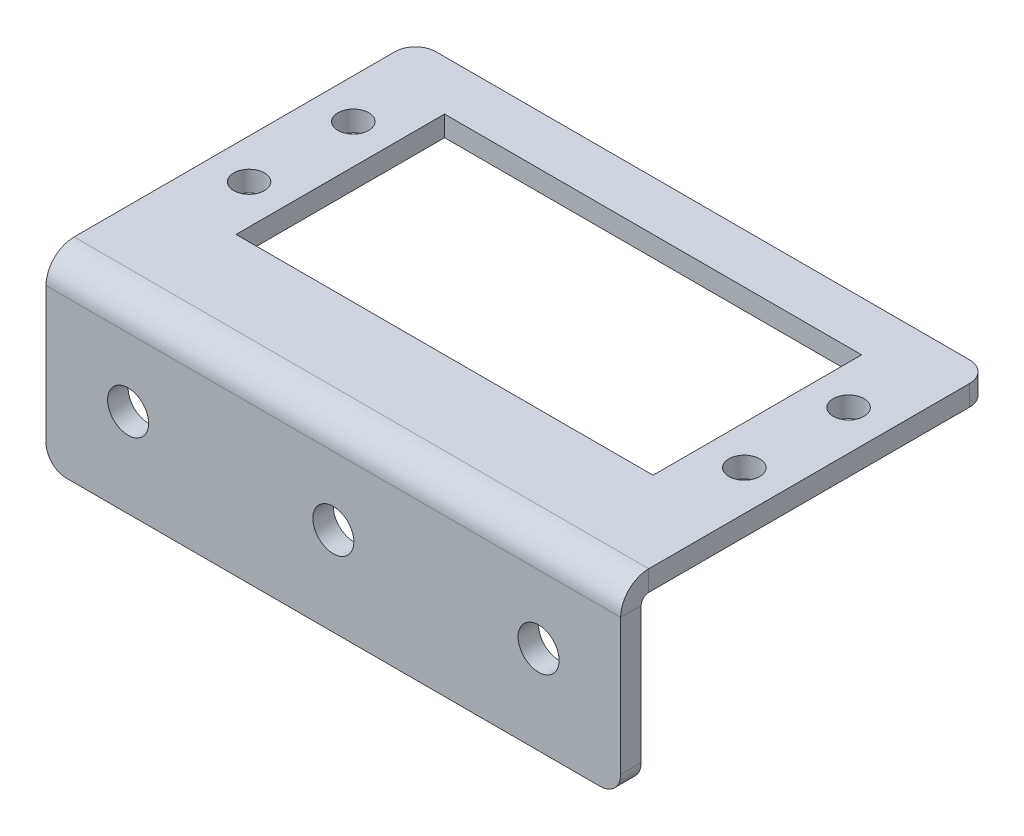
ISO-10303-21;
HEADER;
FILE_DESCRIPTION(('STEP AP214'),'2;1');
FILE_NAME('part.step','',(''),(''),'','','');
FILE_SCHEMA(('AUTOMOTIVE_DESIGN { 1 0 10303 214 1 1 1 1 }'));
ENDSEC;
DATA;
#1=APPLICATION_CONTEXT('core data for automotive mechanical design processes');
#2=APPLICATION_PROTOCOL_DEFINITION('international standard','automotive_design',2000,#1);
#3=PRODUCT_CONTEXT('',#1,'mechanical');
#4=PRODUCT('Part','Part','',(#3));
#5=PRODUCT_RELATED_PRODUCT_CATEGORY('part','',(#4));
#6=PRODUCT_DEFINITION_FORMATION('','',#4);
#7=PRODUCT_DEFINITION_CONTEXT('part definition',#1,'design');
#8=PRODUCT_DEFINITION('design','',#6,#7);
#9=PRODUCT_DEFINITION_SHAPE('','',#8);
#10=(LENGTH_UNIT() NAMED_UNIT(*) SI_UNIT(.MILLI.,.METRE.));
#11=(NAMED_UNIT(*) PLANE_ANGLE_UNIT() SI_UNIT($,.RADIAN.));
#12=(NAMED_UNIT(*) SI_UNIT($,.STERADIAN.) SOLID_ANGLE_UNIT());
#13=UNCERTAINTY_MEASURE_WITH_UNIT(LENGTH_MEASURE(1.E-05),#10,'distance_accuracy_value','');
#14=(GEOMETRIC_REPRESENTATION_CONTEXT(3) GLOBAL_UNCERTAINTY_ASSIGNED_CONTEXT((#13)) GLOBAL_UNIT_ASSIGNED_CONTEXT((#10,
#11,#12)) REPRESENTATION_CONTEXT('',''));
#15=CARTESIAN_POINT('',(0.,0.,0.));
#16=DIRECTION('',(0.,0.,1.));
#17=DIRECTION('',(1.,0.,0.));
#18=AXIS2_PLACEMENT_3D('',#15,#16,#17);
#19=CARTESIAN_POINT('',(-28.,-2.,-17.));
#20=DIRECTION('',(-1.,0.,0.));
#21=DIRECTION('',(0.,0.,1.));
#22=AXIS2_PLACEMENT_3D('',#19,#20,#21);
#23=PLANE('',#22);
#24=DIRECTION('',(0.,0.,1.));
#25=VECTOR('',#24,1.);
#26=CARTESIAN_POINT('',(-28.,0.,-17.));
#27=LINE('',#26,#25);
#28=CARTESIAN_POINT('',(-28.,0.,-15.));
#29=VERTEX_POINT('',#28);
#30=CARTESIAN_POINT('',(-28.,0.,16.2634));
#31=VERTEX_POINT('',#30);
#32=EDGE_CURVE('E249',#29,#31,#27,.T.);
#33=ORIENTED_EDGE('',*,*,#32,.F.);
#34=DIRECTION('',(0.,1.,0.));
#35=VECTOR('',#34,1.);
#36=CARTESIAN_POINT('',(-28.,-2.,-15.));
#37=LINE('',#36,#35);
#38=CARTESIAN_POINT('',(-28.,-2.,-15.));
#39=VERTEX_POINT('',#38);
#40=EDGE_CURVE('E11',#29,#39,#37,.F.);
#41=ORIENTED_EDGE('',*,*,#40,.T.);
#42=DIRECTION('',(0.,0.,1.));
#43=VECTOR('',#42,1.);
#44=CARTESIAN_POINT('',(-28.,-2.,-17.));
#45=LINE('',#44,#43);
#46=CARTESIAN_POINT('',(-28.,-1.99999999999999,16.2634));
#47=VERTEX_POINT('',#46);
#48=EDGE_CURVE('E251',#39,#47,#45,.T.);
#49=ORIENTED_EDGE('',*,*,#48,.T.);
#50=DIRECTION('',(0.,1.,0.));
#51=VECTOR('',#50,1.);
#52=CARTESIAN_POINT('',(-28.,-1.99999999999999,16.2634));
#53=LINE('',#52,#51);
#54=EDGE_CURVE('E229',#47,#31,#53,.T.);
#55=ORIENTED_EDGE('',*,*,#54,.T.);
#56=EDGE_LOOP('',(#33,#41,#49,#55));
#57=FACE_BOUND('',#56,.T.);
#58=ADVANCED_FACE('F37',(#57),#23,.T.);
#59=CARTESIAN_POINT('',(0.,-2.,0.));
#60=DIRECTION('',(0.,1.,0.));
#61=DIRECTION('',(0.,0.,1.));
#62=AXIS2_PLACEMENT_3D('',#59,#60,#61);
#63=PLANE('',#62);
#64=CARTESIAN_POINT('',(24.13,-2.,3.07999999999134));
#65=DIRECTION('',(0.,1.,0.));
#66=DIRECTION('',(0.,0.,1.));
#67=AXIS2_PLACEMENT_3D('',#64,#65,#66);
#68=CIRCLE('',#67,1.5);
#69=CARTESIAN_POINT('',(24.13,-2.,4.57999999999135));
#70=VERTEX_POINT('',#69);
#71=EDGE_CURVE('E555',#70,#70,#68,.T.);
#72=ORIENTED_EDGE('',*,*,#71,.T.);
#73=EDGE_LOOP('',(#72));
#74=FACE_BOUND('',#73,.T.);
#75=CARTESIAN_POINT('',(24.13,-2.,-7.08000000000865));
#76=DIRECTION('',(0.,1.,0.));
#77=DIRECTION('',(0.,0.,1.));
#78=AXIS2_PLACEMENT_3D('',#75,#76,#77);
#79=CIRCLE('',#78,1.5);
#80=CARTESIAN_POINT('',(24.13,-2.,-5.58000000000865));
#81=VERTEX_POINT('',#80);
#82=EDGE_CURVE('E561',#81,#81,#79,.T.);
#83=ORIENTED_EDGE('',*,*,#82,.T.);
#84=EDGE_LOOP('',(#83));
#85=FACE_BOUND('',#84,.T.);
#86=CARTESIAN_POINT('',(-24.13,-2.,3.07999999999134));
#87=DIRECTION('',(0.,1.,0.));
#88=DIRECTION('',(0.,0.,1.));
#89=AXIS2_PLACEMENT_3D('',#86,#87,#88);
#90=CIRCLE('',#89,1.5);
#91=CARTESIAN_POINT('',(-24.13,-2.,4.57999999999135));
#92=VERTEX_POINT('',#91);
#93=EDGE_CURVE('E567',#92,#92,#90,.T.);
#94=ORIENTED_EDGE('',*,*,#93,.T.);
#95=EDGE_LOOP('',(#94));
#96=FACE_BOUND('',#95,.T.);
#97=CARTESIAN_POINT('',(-24.13,-2.,-7.08000000000865));
#98=DIRECTION('',(0.,1.,0.));
#99=DIRECTION('',(0.,0.,1.));
#100=AXIS2_PLACEMENT_3D('',#97,#98,#99);
#101=CIRCLE('',#100,1.5);
#102=CARTESIAN_POINT('',(-24.13,-2.,-5.58000000000865));
#103=VERTEX_POINT('',#102);
#104=EDGE_CURVE('E573',#103,#103,#101,.T.);
#105=ORIENTED_EDGE('',*,*,#104,.T.);
#106=EDGE_LOOP('',(#105));
#107=FACE_BOUND('',#106,.T.);
#108=DIRECTION('',(-1.,0.,0.));
#109=VECTOR('',#108,1.);
#110=CARTESIAN_POINT('',(0.,-2.,-12.1600000000087));
#111=LINE('',#110,#109);
#112=CARTESIAN_POINT('',(20.32,-2.,-12.1600000000087));
#113=VERTEX_POINT('',#112);
#114=CARTESIAN_POINT('',(-20.32,-2.,-12.1600000000087));
#115=VERTEX_POINT('',#114);
#116=EDGE_CURVE('E188',#113,#115,#111,.T.);
#117=ORIENTED_EDGE('',*,*,#116,.T.);
#118=DIRECTION('',(0.,0.,1.));
#119=VECTOR('',#118,1.);
#120=CARTESIAN_POINT('',(-20.32,-2.,0.));
#121=LINE('',#120,#119);
#122=CARTESIAN_POINT('',(-20.32,-2.,8.15999999999125));
#123=VERTEX_POINT('',#122);
#124=EDGE_CURVE('E191',#115,#123,#121,.T.);
#125=ORIENTED_EDGE('',*,*,#124,.T.);
#126=DIRECTION('',(1.,0.,0.));
#127=VECTOR('',#126,1.);
#128=CARTESIAN_POINT('',(0.,-2.,8.15999999999125));
#129=LINE('',#128,#127);
#130=CARTESIAN_POINT('',(20.32,-2.,8.15999999999125));
#131=VERTEX_POINT('',#130);
#132=EDGE_CURVE('E183',#123,#131,#129,.T.);
#133=ORIENTED_EDGE('',*,*,#132,.T.);
#134=DIRECTION('',(0.,0.,-1.));
#135=VECTOR('',#134,1.);
#136=CARTESIAN_POINT('',(20.32,-2.,0.));
#137=LINE('',#136,#135);
#138=EDGE_CURVE('E158',#131,#113,#137,.T.);
#139=ORIENTED_EDGE('',*,*,#138,.T.);
#140=EDGE_LOOP('',(#117,#125,#133,#139));
#141=FACE_BOUND('',#140,.T.);
#142=DIRECTION('',(-1.,0.,0.));
#143=VECTOR('',#142,1.);
#144=CARTESIAN_POINT('',(-28.,-2.,-17.));
#145=LINE('',#144,#143);
#146=CARTESIAN_POINT('',(26.,-2.,-17.));
#147=VERTEX_POINT('',#146);
#148=CARTESIAN_POINT('',(-26.,-2.,-17.));
#149=VERTEX_POINT('',#148);
#150=EDGE_CURVE('E248',#147,#149,#145,.T.);
#151=ORIENTED_EDGE('',*,*,#150,.F.);
#152=CARTESIAN_POINT('',(26.,-2.,-15.));
#153=DIRECTION('',(0.,1.,0.));
#154=DIRECTION('',(0.,0.,1.));
#155=AXIS2_PLACEMENT_3D('',#152,#153,#154);
#156=CIRCLE('',#155,2.);
#157=CARTESIAN_POINT('',(28.,-2.,-15.));
#158=VERTEX_POINT('',#157);
#159=EDGE_CURVE('E45',#147,#158,#156,.F.);
#160=ORIENTED_EDGE('',*,*,#159,.T.);
#161=DIRECTION('',(0.,0.,-1.));
#162=VECTOR('',#161,1.);
#163=CARTESIAN_POINT('',(28.,-2.,-17.));
#164=LINE('',#163,#162);
#165=CARTESIAN_POINT('',(28.,-1.99999999999999,16.2634));
#166=VERTEX_POINT('',#165);
#167=EDGE_CURVE('E245',#166,#158,#164,.T.);
#168=ORIENTED_EDGE('',*,*,#167,.F.);
#169=DIRECTION('',(-1.,0.,0.));
#170=VECTOR('',#169,1.);
#171=CARTESIAN_POINT('',(-28.,-1.99999999999999,16.2634));
#172=LINE('',#171,#170);
#173=EDGE_CURVE('E235',#47,#166,#172,.F.);
#174=ORIENTED_EDGE('',*,*,#173,.F.);
#175=ORIENTED_EDGE('',*,*,#48,.F.);
#176=CARTESIAN_POINT('',(-26.,-2.,-15.));
#177=DIRECTION('',(0.,1.,0.));
#178=DIRECTION('',(0.,0.,1.));
#179=AXIS2_PLACEMENT_3D('',#176,#177,#178);
#180=CIRCLE('',#179,2.);
#181=EDGE_CURVE('E57',#39,#149,#180,.F.);
#182=ORIENTED_EDGE('',*,*,#181,.T.);
#183=EDGE_LOOP('',(#151,#160,#168,#174,#175,#182));
#184=FACE_BOUND('',#183,.T.);
#185=ADVANCED_FACE('F291',(#74,#85,#96,#107,#141,#184),#63,.F.);
#186=CARTESIAN_POINT('',(0.,0.,0.));
#187=DIRECTION('',(0.,1.,0.));
#188=DIRECTION('',(0.,0.,1.));
#189=AXIS2_PLACEMENT_3D('',#186,#187,#188);
#190=PLANE('',#189);
#191=CARTESIAN_POINT('',(24.13,0.,3.07999999999134));
#192=DIRECTION('',(0.,1.,0.));
#193=DIRECTION('',(0.,0.,1.));
#194=AXIS2_PLACEMENT_3D('',#191,#192,#193);
#195=CIRCLE('',#194,1.5);
#196=CARTESIAN_POINT('',(24.13,0.,4.57999999999135));
#197=VERTEX_POINT('',#196);
#198=EDGE_CURVE('E550',#197,#197,#195,.T.);
#199=ORIENTED_EDGE('',*,*,#198,.F.);
#200=EDGE_LOOP('',(#199));
#201=FACE_BOUND('',#200,.T.);
#202=CARTESIAN_POINT('',(24.13,0.,-7.08000000000865));
#203=DIRECTION('',(0.,1.,0.));
#204=DIRECTION('',(0.,0.,1.));
#205=AXIS2_PLACEMENT_3D('',#202,#203,#204);
#206=CIRCLE('',#205,1.5);
#207=CARTESIAN_POINT('',(24.13,0.,-5.58000000000865));
#208=VERTEX_POINT('',#207);
#209=EDGE_CURVE('E558',#208,#208,#206,.T.);
#210=ORIENTED_EDGE('',*,*,#209,.F.);
#211=EDGE_LOOP('',(#210));
#212=FACE_BOUND('',#211,.T.);
#213=CARTESIAN_POINT('',(-24.13,0.,3.07999999999134));
#214=DIRECTION('',(0.,1.,0.));
#215=DIRECTION('',(0.,0.,1.));
#216=AXIS2_PLACEMENT_3D('',#213,#214,#215);
#217=CIRCLE('',#216,1.5);
#218=CARTESIAN_POINT('',(-24.13,0.,4.57999999999135));
#219=VERTEX_POINT('',#218);
#220=EDGE_CURVE('E564',#219,#219,#217,.T.);
#221=ORIENTED_EDGE('',*,*,#220,.F.);
#222=EDGE_LOOP('',(#221));
#223=FACE_BOUND('',#222,.T.);
#224=CARTESIAN_POINT('',(-24.13,0.,-7.08000000000865));
#225=DIRECTION('',(0.,1.,0.));
#226=DIRECTION('',(0.,0.,1.));
#227=AXIS2_PLACEMENT_3D('',#224,#225,#226);
#228=CIRCLE('',#227,1.5);
#229=CARTESIAN_POINT('',(-24.13,0.,-5.58000000000865));
#230=VERTEX_POINT('',#229);
#231=EDGE_CURVE('E570',#230,#230,#228,.T.);
#232=ORIENTED_EDGE('',*,*,#231,.F.);
#233=EDGE_LOOP('',(#232));
#234=FACE_BOUND('',#233,.T.);
#235=DIRECTION('',(0.,0.,1.));
#236=VECTOR('',#235,1.);
#237=CARTESIAN_POINT('',(-20.32,0.,-12.1600000000087));
#238=LINE('',#237,#236);
#239=CARTESIAN_POINT('',(-20.32,0.,-12.1600000000087));
#240=VERTEX_POINT('',#239);
#241=CARTESIAN_POINT('',(-20.32,0.,8.15999999999125));
#242=VERTEX_POINT('',#241);
#243=EDGE_CURVE('E171',#240,#242,#238,.T.);
#244=ORIENTED_EDGE('',*,*,#243,.F.);
#245=DIRECTION('',(-1.,0.,0.));
#246=VECTOR('',#245,1.);
#247=CARTESIAN_POINT('',(-20.32,0.,-12.1600000000087));
#248=LINE('',#247,#246);
#249=CARTESIAN_POINT('',(20.32,0.,-12.1600000000087));
#250=VERTEX_POINT('',#249);
#251=EDGE_CURVE('E176',#250,#240,#248,.T.);
#252=ORIENTED_EDGE('',*,*,#251,.F.);
#253=DIRECTION('',(0.,0.,-1.));
#254=VECTOR('',#253,1.);
#255=CARTESIAN_POINT('',(20.32,0.,-12.1600000000087));
#256=LINE('',#255,#254);
#257=CARTESIAN_POINT('',(20.32,0.,8.15999999999125));
#258=VERTEX_POINT('',#257);
#259=EDGE_CURVE('E155',#258,#250,#256,.T.);
#260=ORIENTED_EDGE('',*,*,#259,.F.);
#261=DIRECTION('',(1.,0.,0.));
#262=VECTOR('',#261,1.);
#263=CARTESIAN_POINT('',(-20.32,0.,8.15999999999125));
#264=LINE('',#263,#262);
#265=EDGE_CURVE('E166',#242,#258,#264,.T.);
#266=ORIENTED_EDGE('',*,*,#265,.F.);
#267=EDGE_LOOP('',(#244,#252,#260,#266));
#268=FACE_BOUND('',#267,.T.);
#269=DIRECTION('',(0.,0.,-1.));
#270=VECTOR('',#269,1.);
#271=CARTESIAN_POINT('',(28.,0.,-17.));
#272=LINE('',#271,#270);
#273=CARTESIAN_POINT('',(28.,0.,16.2634));
#274=VERTEX_POINT('',#273);
#275=CARTESIAN_POINT('',(28.,0.,-15.));
#276=VERTEX_POINT('',#275);
#277=EDGE_CURVE('E242',#274,#276,#272,.T.);
#278=ORIENTED_EDGE('',*,*,#277,.T.);
#279=CARTESIAN_POINT('',(26.,0.,-15.));
#280=DIRECTION('',(0.,1.,0.));
#281=DIRECTION('',(0.,0.,1.));
#282=AXIS2_PLACEMENT_3D('',#279,#280,#281);
#283=CIRCLE('',#282,2.);
#284=CARTESIAN_POINT('',(26.,0.,-17.));
#285=VERTEX_POINT('',#284);
#286=EDGE_CURVE('E282',#276,#285,#283,.T.);
#287=ORIENTED_EDGE('',*,*,#286,.T.);
#288=DIRECTION('',(-1.,0.,0.));
#289=VECTOR('',#288,1.);
#290=CARTESIAN_POINT('',(-28.,0.,-17.));
#291=LINE('',#290,#289);
#292=CARTESIAN_POINT('',(-26.,0.,-17.));
#293=VERTEX_POINT('',#292);
#294=EDGE_CURVE('E256',#285,#293,#291,.T.);
#295=ORIENTED_EDGE('',*,*,#294,.T.);
#296=CARTESIAN_POINT('',(-26.,0.,-15.));
#297=DIRECTION('',(0.,1.,0.));
#298=DIRECTION('',(0.,0.,1.));
#299=AXIS2_PLACEMENT_3D('',#296,#297,#298);
#300=CIRCLE('',#299,2.);
#301=EDGE_CURVE('E280',#293,#29,#300,.T.);
#302=ORIENTED_EDGE('',*,*,#301,.T.);
#303=ORIENTED_EDGE('',*,*,#32,.T.);
#304=DIRECTION('',(-1.,0.,0.));
#305=VECTOR('',#304,1.);
#306=CARTESIAN_POINT('',(-28.,0.,16.2634));
#307=LINE('',#306,#305);
#308=EDGE_CURVE('E222',#31,#274,#307,.F.);
#309=ORIENTED_EDGE('',*,*,#308,.T.);
#310=EDGE_LOOP('',(#278,#287,#295,#302,#303,#309));
#311=FACE_BOUND('',#310,.T.);
#312=ADVANCED_FACE('F173',(#201,#212,#223,#234,#268,#311),#190,.T.);
#313=CARTESIAN_POINT('',(28.,-2.,-17.));
#314=DIRECTION('',(1.,0.,0.));
#315=DIRECTION('',(0.,0.,-1.));
#316=AXIS2_PLACEMENT_3D('',#313,#314,#315);
#317=PLANE('',#316);
#318=ORIENTED_EDGE('',*,*,#167,.T.);
#319=DIRECTION('',(0.,1.,0.));
#320=VECTOR('',#319,1.);
#321=CARTESIAN_POINT('',(28.,-2.,-15.));
#322=LINE('',#321,#320);
#323=EDGE_CURVE('E277',#158,#276,#322,.T.);
#324=ORIENTED_EDGE('',*,*,#323,.T.);
#325=ORIENTED_EDGE('',*,*,#277,.F.);
#326=DIRECTION('',(0.,1.,0.));
#327=VECTOR('',#326,1.);
#328=CARTESIAN_POINT('',(28.,-1.99999999999999,16.2634));
#329=LINE('',#328,#327);
#330=EDGE_CURVE('E239',#166,#274,#329,.T.);
#331=ORIENTED_EDGE('',*,*,#330,.F.);
#332=EDGE_LOOP('',(#318,#324,#325,#331));
#333=FACE_BOUND('',#332,.T.);
#334=ADVANCED_FACE('F298',(#333),#317,.T.);
#335=CARTESIAN_POINT('',(-28.,-2.,-17.));
#336=DIRECTION('',(0.,0.,-1.));
#337=DIRECTION('',(-1.,0.,0.));
#338=AXIS2_PLACEMENT_3D('',#335,#336,#337);
#339=PLANE('',#338);
#340=ORIENTED_EDGE('',*,*,#294,.F.);
#341=DIRECTION('',(0.,1.,0.));
#342=VECTOR('',#341,1.);
#343=CARTESIAN_POINT('',(26.,-2.,-17.));
#344=LINE('',#343,#342);
#345=EDGE_CURVE('E287',#285,#147,#344,.F.);
#346=ORIENTED_EDGE('',*,*,#345,.T.);
#347=ORIENTED_EDGE('',*,*,#150,.T.);
#348=DIRECTION('',(0.,1.,0.));
#349=VECTOR('',#348,1.);
#350=CARTESIAN_POINT('',(-26.,-2.,-17.));
#351=LINE('',#350,#349);
#352=EDGE_CURVE('E284',#149,#293,#351,.T.);
#353=ORIENTED_EDGE('',*,*,#352,.T.);
#354=EDGE_LOOP('',(#340,#346,#347,#353));
#355=FACE_BOUND('',#354,.T.);
#356=ADVANCED_FACE('F303',(#355),#339,.T.);
#357=CARTESIAN_POINT('',(28.,-2.7366,16.2634));
#358=DIRECTION('',(1.,0.,0.));
#359=DIRECTION('',(0.,0.,-1.));
#360=AXIS2_PLACEMENT_3D('',#357,#358,#359);
#361=PLANE('',#360);
#362=DIRECTION('',(0.,0.,1.));
#363=VECTOR('',#362,1.);
#364=CARTESIAN_POINT('',(28.,-2.7366,17.));
#365=LINE('',#364,#363);
#366=CARTESIAN_POINT('',(28.,-2.73659999999999,17.));
#367=VERTEX_POINT('',#366);
#368=CARTESIAN_POINT('',(28.,-2.73659999999999,19.));
#369=VERTEX_POINT('',#368);
#370=EDGE_CURVE('E194',#367,#369,#365,.T.);
#371=ORIENTED_EDGE('',*,*,#370,.F.);
#372=CARTESIAN_POINT('',(28.,-2.7366,16.2634));
#373=DIRECTION('',(-1.,0.,0.));
#374=DIRECTION('',(0.,0.,1.));
#375=AXIS2_PLACEMENT_3D('',#372,#373,#374);
#376=CIRCLE('',#375,0.7366);
#377=EDGE_CURVE('E232',#166,#367,#376,.F.);
#378=ORIENTED_EDGE('',*,*,#377,.F.);
#379=ORIENTED_EDGE('',*,*,#330,.T.);
#380=CARTESIAN_POINT('',(28.,-2.7366,16.2634));
#381=DIRECTION('',(-1.,0.,0.));
#382=DIRECTION('',(0.,0.,1.));
#383=AXIS2_PLACEMENT_3D('',#380,#381,#382);
#384=CIRCLE('',#383,2.7366);
#385=EDGE_CURVE('E225',#274,#369,#384,.F.);
#386=ORIENTED_EDGE('',*,*,#385,.T.);
#387=EDGE_LOOP('',(#371,#378,#379,#386));
#388=FACE_BOUND('',#387,.T.);
#389=ADVANCED_FACE('F345',(#388),#361,.T.);
#390=CARTESIAN_POINT('',(-28.,-2.7366,16.2634));
#391=DIRECTION('',(1.,0.,0.));
#392=DIRECTION('',(0.,0.,-1.));
#393=AXIS2_PLACEMENT_3D('',#390,#391,#392);
#394=PLANE('',#393);
#395=CARTESIAN_POINT('',(-28.,-2.7366,16.2634));
#396=DIRECTION('',(-1.,0.,0.));
#397=DIRECTION('',(0.,0.,1.));
#398=AXIS2_PLACEMENT_3D('',#395,#396,#397);
#399=CIRCLE('',#398,0.7366);
#400=CARTESIAN_POINT('',(-28.,-2.73659999999999,17.));
#401=VERTEX_POINT('',#400);
#402=EDGE_CURVE('E215',#401,#47,#399,.T.);
#403=ORIENTED_EDGE('',*,*,#402,.F.);
#404=DIRECTION('',(0.,0.,1.));
#405=VECTOR('',#404,1.);
#406=CARTESIAN_POINT('',(-28.,-2.7366,17.));
#407=LINE('',#406,#405);
#408=CARTESIAN_POINT('',(-28.,-2.7366,19.));
#409=VERTEX_POINT('',#408);
#410=EDGE_CURVE('E197',#401,#409,#407,.T.);
#411=ORIENTED_EDGE('',*,*,#410,.T.);
#412=CARTESIAN_POINT('',(-28.,-2.7366,16.2634));
#413=DIRECTION('',(-1.,0.,0.));
#414=DIRECTION('',(0.,0.,1.));
#415=AXIS2_PLACEMENT_3D('',#412,#413,#414);
#416=CIRCLE('',#415,2.7366);
#417=EDGE_CURVE('E226',#409,#31,#416,.T.);
#418=ORIENTED_EDGE('',*,*,#417,.T.);
#419=ORIENTED_EDGE('',*,*,#54,.F.);
#420=EDGE_LOOP('',(#403,#411,#418,#419));
#421=FACE_BOUND('',#420,.T.);
#422=ADVANCED_FACE('F310',(#421),#394,.F.);
#423=CARTESIAN_POINT('',(-28.,-2.7366,16.2634));
#424=DIRECTION('',(-1.,0.,0.));
#425=DIRECTION('',(0.,0.,1.));
#426=AXIS2_PLACEMENT_3D('',#423,#424,#425);
#427=CYLINDRICAL_SURFACE('',#426,2.7366);
#428=ORIENTED_EDGE('',*,*,#308,.F.);
#429=ORIENTED_EDGE('',*,*,#417,.F.);
#430=DIRECTION('',(1.,0.,0.));
#431=VECTOR('',#430,1.);
#432=CARTESIAN_POINT('',(0.,-2.7366,19.));
#433=LINE('',#432,#431);
#434=EDGE_CURVE('E200',#409,#369,#433,.T.);
#435=ORIENTED_EDGE('',*,*,#434,.T.);
#436=ORIENTED_EDGE('',*,*,#385,.F.);
#437=EDGE_LOOP('',(#428,#429,#435,#436));
#438=FACE_BOUND('',#437,.T.);
#439=ADVANCED_FACE('F347',(#438),#427,.T.);
#440=CARTESIAN_POINT('',(-28.,-2.7366,16.2634));
#441=DIRECTION('',(-1.,0.,0.));
#442=DIRECTION('',(0.,0.,1.));
#443=AXIS2_PLACEMENT_3D('',#440,#441,#442);
#444=CYLINDRICAL_SURFACE('',#443,0.7366);
#445=ORIENTED_EDGE('',*,*,#173,.T.);
#446=ORIENTED_EDGE('',*,*,#377,.T.);
#447=DIRECTION('',(-1.,0.,0.));
#448=VECTOR('',#447,1.);
#449=CARTESIAN_POINT('',(28.,-2.7366,17.));
#450=LINE('',#449,#448);
#451=EDGE_CURVE('E195',#367,#401,#450,.T.);
#452=ORIENTED_EDGE('',*,*,#451,.T.);
#453=ORIENTED_EDGE('',*,*,#402,.T.);
#454=EDGE_LOOP('',(#445,#446,#452,#453));
#455=FACE_BOUND('',#454,.T.);
#456=ADVANCED_FACE('F313',(#455),#444,.F.);
#457=CARTESIAN_POINT('',(-28.,-18.,19.0000000000001));
#458=DIRECTION('',(1.,0.,0.));
#459=DIRECTION('',(0.,1.,0.));
#460=AXIS2_PLACEMENT_3D('',#457,#458,#459);
#461=PLANE('',#460);
#462=DIRECTION('',(0.,-1.,0.));
#463=VECTOR('',#462,1.);
#464=CARTESIAN_POINT('',(-28.,-18.,17.0000000000001));
#465=LINE('',#464,#463);
#466=CARTESIAN_POINT('',(-28.,-16.,17.));
#467=VERTEX_POINT('',#466);
#468=EDGE_CURVE('E205',#401,#467,#465,.T.);
#469=ORIENTED_EDGE('',*,*,#468,.T.);
#470=DIRECTION('',(0.,0.,-1.));
#471=VECTOR('',#470,1.);
#472=CARTESIAN_POINT('',(-28.,-16.,19.));
#473=LINE('',#472,#471);
#474=CARTESIAN_POINT('',(-28.,-16.,19.));
#475=VERTEX_POINT('',#474);
#476=EDGE_CURVE('E275',#467,#475,#473,.F.);
#477=ORIENTED_EDGE('',*,*,#476,.T.);
#478=DIRECTION('',(0.,-1.,0.));
#479=VECTOR('',#478,1.);
#480=CARTESIAN_POINT('',(-28.,-18.,19.0000000000001));
#481=LINE('',#480,#479);
#482=EDGE_CURVE('E206',#409,#475,#481,.T.);
#483=ORIENTED_EDGE('',*,*,#482,.F.);
#484=ORIENTED_EDGE('',*,*,#410,.F.);
#485=EDGE_LOOP('',(#469,#477,#483,#484));
#486=FACE_BOUND('',#485,.T.);
#487=ADVANCED_FACE('F323',(#486),#461,.F.);
#488=CARTESIAN_POINT('',(28.,-1.99999999999999,19.));
#489=DIRECTION('',(-1.,0.,0.));
#490=DIRECTION('',(0.,0.,1.));
#491=AXIS2_PLACEMENT_3D('',#488,#489,#490);
#492=PLANE('',#491);
#493=DIRECTION('',(0.,1.,0.));
#494=VECTOR('',#493,1.);
#495=CARTESIAN_POINT('',(28.,-1.99999999999999,19.));
#496=LINE('',#495,#494);
#497=CARTESIAN_POINT('',(28.,-16.,19.));
#498=VERTEX_POINT('',#497);
#499=EDGE_CURVE('E213',#498,#369,#496,.T.);
#500=ORIENTED_EDGE('',*,*,#499,.F.);
#501=DIRECTION('',(0.,0.,-1.));
#502=VECTOR('',#501,1.);
#503=CARTESIAN_POINT('',(28.,-16.,19.));
#504=LINE('',#503,#502);
#505=CARTESIAN_POINT('',(28.,-16.,17.));
#506=VERTEX_POINT('',#505);
#507=EDGE_CURVE('E253',#498,#506,#504,.T.);
#508=ORIENTED_EDGE('',*,*,#507,.T.);
#509=DIRECTION('',(0.,1.,0.));
#510=VECTOR('',#509,1.);
#511=CARTESIAN_POINT('',(28.,-2.,17.));
#512=LINE('',#511,#510);
#513=EDGE_CURVE('E210',#506,#367,#512,.T.);
#514=ORIENTED_EDGE('',*,*,#513,.T.);
#515=ORIENTED_EDGE('',*,*,#370,.T.);
#516=EDGE_LOOP('',(#500,#508,#514,#515));
#517=FACE_BOUND('',#516,.T.);
#518=ADVANCED_FACE('F342',(#517),#492,.F.);
#519=CARTESIAN_POINT('',(0.,0.,19.));
#520=DIRECTION('',(0.,0.,-1.));
#521=DIRECTION('',(0.,1.,0.));
#522=AXIS2_PLACEMENT_3D('',#519,#520,#521);
#523=PLANE('',#522);
#524=CARTESIAN_POINT('',(-20.,-9.36829999999999,19.0000000000001));
#525=DIRECTION('',(0.,0.,-1.));
#526=DIRECTION('',(0.,1.,0.));
#527=AXIS2_PLACEMENT_3D('',#524,#525,#526);
#528=CIRCLE('',#527,2.);
#529=CARTESIAN_POINT('',(-20.,-7.36829999999999,19.0000000000001));
#530=VERTEX_POINT('',#529);
#531=EDGE_CURVE('E533',#530,#530,#528,.T.);
#532=ORIENTED_EDGE('',*,*,#531,.T.);
#533=EDGE_LOOP('',(#532));
#534=FACE_BOUND('',#533,.T.);
#535=CARTESIAN_POINT('',(20.,-9.36829999999999,19.0000000000001));
#536=DIRECTION('',(0.,0.,-1.));
#537=DIRECTION('',(0.,1.,0.));
#538=AXIS2_PLACEMENT_3D('',#535,#536,#537);
#539=CIRCLE('',#538,2.);
#540=CARTESIAN_POINT('',(20.,-7.36829999999999,19.0000000000001));
#541=VERTEX_POINT('',#540);
#542=EDGE_CURVE('E541',#541,#541,#539,.T.);
#543=ORIENTED_EDGE('',*,*,#542,.T.);
#544=EDGE_LOOP('',(#543));
#545=FACE_BOUND('',#544,.T.);
#546=CARTESIAN_POINT('',(0.,-9.36829999999999,19.0000000000001));
#547=DIRECTION('',(0.,0.,-1.));
#548=DIRECTION('',(0.,1.,0.));
#549=AXIS2_PLACEMENT_3D('',#546,#547,#548);
#550=CIRCLE('',#549,2.);
#551=CARTESIAN_POINT('',(0.,-7.36829999999999,19.0000000000001));
#552=VERTEX_POINT('',#551);
#553=EDGE_CURVE('E547',#552,#552,#550,.T.);
#554=ORIENTED_EDGE('',*,*,#553,.T.);
#555=EDGE_LOOP('',(#554));
#556=FACE_BOUND('',#555,.T.);
#557=DIRECTION('',(1.,0.,0.));
#558=VECTOR('',#557,1.);
#559=CARTESIAN_POINT('',(28.,-18.,19.0000000000001));
#560=LINE('',#559,#558);
#561=CARTESIAN_POINT('',(-26.,-18.,19.0000000000001));
#562=VERTEX_POINT('',#561);
#563=CARTESIAN_POINT('',(26.,-18.,19.0000000000001));
#564=VERTEX_POINT('',#563);
#565=EDGE_CURVE('E209',#562,#564,#560,.T.);
#566=ORIENTED_EDGE('',*,*,#565,.T.);
#567=CARTESIAN_POINT('',(26.,-16.,19.));
#568=DIRECTION('',(0.,0.,-1.));
#569=DIRECTION('',(0.,1.,0.));
#570=AXIS2_PLACEMENT_3D('',#567,#568,#569);
#571=CIRCLE('',#570,2.);
#572=EDGE_CURVE('E273',#564,#498,#571,.F.);
#573=ORIENTED_EDGE('',*,*,#572,.T.);
#574=ORIENTED_EDGE('',*,*,#499,.T.);
#575=ORIENTED_EDGE('',*,*,#434,.F.);
#576=ORIENTED_EDGE('',*,*,#482,.T.);
#577=CARTESIAN_POINT('',(-26.,-16.,19.));
#578=DIRECTION('',(0.,0.,-1.));
#579=DIRECTION('',(0.,1.,0.));
#580=AXIS2_PLACEMENT_3D('',#577,#578,#579);
#581=CIRCLE('',#580,2.);
#582=EDGE_CURVE('E271',#475,#562,#581,.F.);
#583=ORIENTED_EDGE('',*,*,#582,.T.);
#584=EDGE_LOOP('',(#566,#573,#574,#575,#576,#583));
#585=FACE_BOUND('',#584,.T.);
#586=ADVANCED_FACE('F331',(#534,#545,#556,#585),#523,.F.);
#587=CARTESIAN_POINT('',(0.,0.,17.));
#588=DIRECTION('',(0.,0.,-1.));
#589=DIRECTION('',(0.,1.,0.));
#590=AXIS2_PLACEMENT_3D('',#587,#588,#589);
#591=PLANE('',#590);
#592=CARTESIAN_POINT('',(-20.,-9.3683,17.));
#593=DIRECTION('',(0.,0.,-1.));
#594=DIRECTION('',(0.,1.,0.));
#595=AXIS2_PLACEMENT_3D('',#592,#593,#594);
#596=CIRCLE('',#595,2.);
#597=CARTESIAN_POINT('',(-20.,-7.3683,17.));
#598=VERTEX_POINT('',#597);
#599=EDGE_CURVE('E536',#598,#598,#596,.T.);
#600=ORIENTED_EDGE('',*,*,#599,.F.);
#601=EDGE_LOOP('',(#600));
#602=FACE_BOUND('',#601,.T.);
#603=CARTESIAN_POINT('',(20.,-9.3683,17.));
#604=DIRECTION('',(0.,0.,-1.));
#605=DIRECTION('',(0.,1.,0.));
#606=AXIS2_PLACEMENT_3D('',#603,#604,#605);
#607=CIRCLE('',#606,2.);
#608=CARTESIAN_POINT('',(20.,-7.3683,17.));
#609=VERTEX_POINT('',#608);
#610=EDGE_CURVE('E538',#609,#609,#607,.T.);
#611=ORIENTED_EDGE('',*,*,#610,.F.);
#612=EDGE_LOOP('',(#611));
#613=FACE_BOUND('',#612,.T.);
#614=CARTESIAN_POINT('',(0.,-9.3683,17.));
#615=DIRECTION('',(0.,0.,-1.));
#616=DIRECTION('',(0.,1.,0.));
#617=AXIS2_PLACEMENT_3D('',#614,#615,#616);
#618=CIRCLE('',#617,2.);
#619=CARTESIAN_POINT('',(0.,-7.3683,17.));
#620=VERTEX_POINT('',#619);
#621=EDGE_CURVE('E544',#620,#620,#618,.T.);
#622=ORIENTED_EDGE('',*,*,#621,.F.);
#623=EDGE_LOOP('',(#622));
#624=FACE_BOUND('',#623,.T.);
#625=ORIENTED_EDGE('',*,*,#513,.F.);
#626=CARTESIAN_POINT('',(26.,-16.,17.));
#627=DIRECTION('',(0.,0.,-1.));
#628=DIRECTION('',(0.,1.,0.));
#629=AXIS2_PLACEMENT_3D('',#626,#627,#628);
#630=CIRCLE('',#629,2.);
#631=CARTESIAN_POINT('',(26.,-18.,17.0000000000001));
#632=VERTEX_POINT('',#631);
#633=EDGE_CURVE('E264',#506,#632,#630,.T.);
#634=ORIENTED_EDGE('',*,*,#633,.T.);
#635=DIRECTION('',(1.,0.,0.));
#636=VECTOR('',#635,1.);
#637=CARTESIAN_POINT('',(28.,-18.,17.0000000000001));
#638=LINE('',#637,#636);
#639=CARTESIAN_POINT('',(-26.,-18.,17.0000000000001));
#640=VERTEX_POINT('',#639);
#641=EDGE_CURVE('E218',#640,#632,#638,.T.);
#642=ORIENTED_EDGE('',*,*,#641,.F.);
#643=CARTESIAN_POINT('',(-26.,-16.,17.));
#644=DIRECTION('',(0.,0.,-1.));
#645=DIRECTION('',(0.,1.,0.));
#646=AXIS2_PLACEMENT_3D('',#643,#644,#645);
#647=CIRCLE('',#646,2.);
#648=EDGE_CURVE('E262',#640,#467,#647,.T.);
#649=ORIENTED_EDGE('',*,*,#648,.T.);
#650=ORIENTED_EDGE('',*,*,#468,.F.);
#651=ORIENTED_EDGE('',*,*,#451,.F.);
#652=EDGE_LOOP('',(#625,#634,#642,#649,#650,#651));
#653=FACE_BOUND('',#652,.T.);
#654=ADVANCED_FACE('F319',(#602,#613,#624,#653),#591,.T.);
#655=CARTESIAN_POINT('',(28.,-18.,19.0000000000001));
#656=DIRECTION('',(0.,1.,0.));
#657=DIRECTION('',(0.,0.,1.));
#658=AXIS2_PLACEMENT_3D('',#655,#656,#657);
#659=PLANE('',#658);
#660=ORIENTED_EDGE('',*,*,#641,.T.);
#661=DIRECTION('',(0.,0.,-1.));
#662=VECTOR('',#661,1.);
#663=CARTESIAN_POINT('',(26.,-18.,19.0000000000001));
#664=LINE('',#663,#662);
#665=EDGE_CURVE('E269',#632,#564,#664,.F.);
#666=ORIENTED_EDGE('',*,*,#665,.T.);
#667=ORIENTED_EDGE('',*,*,#565,.F.);
#668=DIRECTION('',(0.,0.,-1.));
#669=VECTOR('',#668,1.);
#670=CARTESIAN_POINT('',(-26.,-18.,19.0000000000001));
#671=LINE('',#670,#669);
#672=EDGE_CURVE('E266',#562,#640,#671,.T.);
#673=ORIENTED_EDGE('',*,*,#672,.T.);
#674=EDGE_LOOP('',(#660,#666,#667,#673));
#675=FACE_BOUND('',#674,.T.);
#676=ADVANCED_FACE('F335',(#675),#659,.F.);
#677=CARTESIAN_POINT('',(-20.32,-18.,-12.1600000000087));
#678=DIRECTION('',(-1.,0.,0.));
#679=DIRECTION('',(0.,0.,1.));
#680=AXIS2_PLACEMENT_3D('',#677,#678,#679);
#681=PLANE('',#680);
#682=DIRECTION('',(0.,1.,0.));
#683=VECTOR('',#682,1.);
#684=CARTESIAN_POINT('',(-20.32,-18.,-12.1600000000087));
#685=LINE('',#684,#683);
#686=EDGE_CURVE('E181',#115,#240,#685,.T.);
#687=ORIENTED_EDGE('',*,*,#686,.T.);
#688=ORIENTED_EDGE('',*,*,#243,.T.);
#689=DIRECTION('',(0.,1.,0.));
#690=VECTOR('',#689,1.);
#691=CARTESIAN_POINT('',(-20.32,-18.,8.15999999999125));
#692=LINE('',#691,#690);
#693=EDGE_CURVE('E162',#123,#242,#692,.T.);
#694=ORIENTED_EDGE('',*,*,#693,.F.);
#695=ORIENTED_EDGE('',*,*,#124,.F.);
#696=EDGE_LOOP('',(#687,#688,#694,#695));
#697=FACE_BOUND('',#696,.T.);
#698=ADVANCED_FACE('F413',(#697),#681,.F.);
#699=CARTESIAN_POINT('',(-20.32,-18.,-12.1600000000087));
#700=DIRECTION('',(0.,0.,-1.));
#701=DIRECTION('',(-1.,0.,0.));
#702=AXIS2_PLACEMENT_3D('',#699,#700,#701);
#703=PLANE('',#702);
#704=DIRECTION('',(0.,1.,0.));
#705=VECTOR('',#704,1.);
#706=CARTESIAN_POINT('',(20.32,-18.,-12.1600000000087));
#707=LINE('',#706,#705);
#708=EDGE_CURVE('E161',#113,#250,#707,.T.);
#709=ORIENTED_EDGE('',*,*,#708,.T.);
#710=ORIENTED_EDGE('',*,*,#251,.T.);
#711=ORIENTED_EDGE('',*,*,#686,.F.);
#712=ORIENTED_EDGE('',*,*,#116,.F.);
#713=EDGE_LOOP('',(#709,#710,#711,#712));
#714=FACE_BOUND('',#713,.T.);
#715=ADVANCED_FACE('F410',(#714),#703,.F.);
#716=CARTESIAN_POINT('',(20.32,-18.,-12.1600000000087));
#717=DIRECTION('',(1.,0.,0.));
#718=DIRECTION('',(0.,0.,-1.));
#719=AXIS2_PLACEMENT_3D('',#716,#717,#718);
#720=PLANE('',#719);
#721=DIRECTION('',(0.,1.,0.));
#722=VECTOR('',#721,1.);
#723=CARTESIAN_POINT('',(20.32,-18.,8.15999999999125));
#724=LINE('',#723,#722);
#725=EDGE_CURVE('E150',#131,#258,#724,.T.);
#726=ORIENTED_EDGE('',*,*,#725,.T.);
#727=ORIENTED_EDGE('',*,*,#259,.T.);
#728=ORIENTED_EDGE('',*,*,#708,.F.);
#729=ORIENTED_EDGE('',*,*,#138,.F.);
#730=EDGE_LOOP('',(#726,#727,#728,#729));
#731=FACE_BOUND('',#730,.T.);
#732=ADVANCED_FACE('F152',(#731),#720,.F.);
#733=CARTESIAN_POINT('',(-20.32,-18.,8.15999999999125));
#734=DIRECTION('',(0.,0.,1.));
#735=DIRECTION('',(1.,0.,0.));
#736=AXIS2_PLACEMENT_3D('',#733,#734,#735);
#737=PLANE('',#736);
#738=ORIENTED_EDGE('',*,*,#693,.T.);
#739=ORIENTED_EDGE('',*,*,#265,.T.);
#740=ORIENTED_EDGE('',*,*,#725,.F.);
#741=ORIENTED_EDGE('',*,*,#132,.F.);
#742=EDGE_LOOP('',(#738,#739,#740,#741));
#743=FACE_BOUND('',#742,.T.);
#744=ADVANCED_FACE('F167',(#743),#737,.F.);
#745=CARTESIAN_POINT('',(-24.13,-18.,-7.08000000000865));
#746=DIRECTION('',(0.,1.,0.));
#747=DIRECTION('',(0.,0.,1.));
#748=AXIS2_PLACEMENT_3D('',#745,#746,#747);
#749=CYLINDRICAL_SURFACE('',#748,1.5);
#750=ORIENTED_EDGE('',*,*,#231,.T.);
#751=EDGE_LOOP('',(#750));
#752=FACE_BOUND('',#751,.T.);
#753=ORIENTED_EDGE('',*,*,#104,.F.);
#754=EDGE_LOOP('',(#753));
#755=FACE_BOUND('',#754,.T.);
#756=ADVANCED_FACE('F405',(#752,#755),#749,.F.);
#757=CARTESIAN_POINT('',(-24.13,-18.,3.07999999999134));
#758=DIRECTION('',(0.,1.,0.));
#759=DIRECTION('',(0.,0.,1.));
#760=AXIS2_PLACEMENT_3D('',#757,#758,#759);
#761=CYLINDRICAL_SURFACE('',#760,1.5);
#762=ORIENTED_EDGE('',*,*,#220,.T.);
#763=EDGE_LOOP('',(#762));
#764=FACE_BOUND('',#763,.T.);
#765=ORIENTED_EDGE('',*,*,#93,.F.);
#766=EDGE_LOOP('',(#765));
#767=FACE_BOUND('',#766,.T.);
#768=ADVANCED_FACE('F401',(#764,#767),#761,.F.);
#769=CARTESIAN_POINT('',(24.13,-18.,-7.08000000000865));
#770=DIRECTION('',(0.,1.,0.));
#771=DIRECTION('',(0.,0.,1.));
#772=AXIS2_PLACEMENT_3D('',#769,#770,#771);
#773=CYLINDRICAL_SURFACE('',#772,1.5);
#774=ORIENTED_EDGE('',*,*,#209,.T.);
#775=EDGE_LOOP('',(#774));
#776=FACE_BOUND('',#775,.T.);
#777=ORIENTED_EDGE('',*,*,#82,.F.);
#778=EDGE_LOOP('',(#777));
#779=FACE_BOUND('',#778,.T.);
#780=ADVANCED_FACE('F397',(#776,#779),#773,.F.);
#781=CARTESIAN_POINT('',(24.13,-18.,3.07999999999134));
#782=DIRECTION('',(0.,1.,0.));
#783=DIRECTION('',(0.,0.,1.));
#784=AXIS2_PLACEMENT_3D('',#781,#782,#783);
#785=CYLINDRICAL_SURFACE('',#784,1.5);
#786=ORIENTED_EDGE('',*,*,#198,.T.);
#787=EDGE_LOOP('',(#786));
#788=FACE_BOUND('',#787,.T.);
#789=ORIENTED_EDGE('',*,*,#71,.F.);
#790=EDGE_LOOP('',(#789));
#791=FACE_BOUND('',#790,.T.);
#792=ADVANCED_FACE('F372',(#788,#791),#785,.F.);
#793=CARTESIAN_POINT('',(26.,-16.,19.));
#794=DIRECTION('',(0.,0.,-1.));
#795=DIRECTION('',(0.,1.,0.));
#796=AXIS2_PLACEMENT_3D('',#793,#794,#795);
#797=CYLINDRICAL_SURFACE('',#796,2.);
#798=ORIENTED_EDGE('',*,*,#572,.F.);
#799=ORIENTED_EDGE('',*,*,#665,.F.);
#800=ORIENTED_EDGE('',*,*,#633,.F.);
#801=ORIENTED_EDGE('',*,*,#507,.F.);
#802=EDGE_LOOP('',(#798,#799,#800,#801));
#803=FACE_BOUND('',#802,.T.);
#804=ADVANCED_FACE('F338',(#803),#797,.T.);
#805=CARTESIAN_POINT('',(-26.,-16.,19.));
#806=DIRECTION('',(0.,0.,-1.));
#807=DIRECTION('',(0.,1.,0.));
#808=AXIS2_PLACEMENT_3D('',#805,#806,#807);
#809=CYLINDRICAL_SURFACE('',#808,2.);
#810=ORIENTED_EDGE('',*,*,#582,.F.);
#811=ORIENTED_EDGE('',*,*,#476,.F.);
#812=ORIENTED_EDGE('',*,*,#648,.F.);
#813=ORIENTED_EDGE('',*,*,#672,.F.);
#814=EDGE_LOOP('',(#810,#811,#812,#813));
#815=FACE_BOUND('',#814,.T.);
#816=ADVANCED_FACE('F327',(#815),#809,.T.);
#817=CARTESIAN_POINT('',(26.,-2.,-15.));
#818=DIRECTION('',(0.,1.,0.));
#819=DIRECTION('',(0.,0.,1.));
#820=AXIS2_PLACEMENT_3D('',#817,#818,#819);
#821=CYLINDRICAL_SURFACE('',#820,2.);
#822=ORIENTED_EDGE('',*,*,#159,.F.);
#823=ORIENTED_EDGE('',*,*,#345,.F.);
#824=ORIENTED_EDGE('',*,*,#286,.F.);
#825=ORIENTED_EDGE('',*,*,#323,.F.);
#826=EDGE_LOOP('',(#822,#823,#824,#825));
#827=FACE_BOUND('',#826,.T.);
#828=ADVANCED_FACE('F300',(#827),#821,.T.);
#829=CARTESIAN_POINT('',(-26.,-2.,-15.));
#830=DIRECTION('',(0.,1.,0.));
#831=DIRECTION('',(0.,0.,1.));
#832=AXIS2_PLACEMENT_3D('',#829,#830,#831);
#833=CYLINDRICAL_SURFACE('',#832,2.);
#834=ORIENTED_EDGE('',*,*,#181,.F.);
#835=ORIENTED_EDGE('',*,*,#40,.F.);
#836=ORIENTED_EDGE('',*,*,#301,.F.);
#837=ORIENTED_EDGE('',*,*,#352,.F.);
#838=EDGE_LOOP('',(#834,#835,#836,#837));
#839=FACE_BOUND('',#838,.T.);
#840=ADVANCED_FACE('F39',(#839),#833,.T.);
#841=CARTESIAN_POINT('',(0.,-9.36829999999999,19.0000000000001));
#842=DIRECTION('',(0.,0.,-1.));
#843=DIRECTION('',(0.,1.,0.));
#844=AXIS2_PLACEMENT_3D('',#841,#842,#843);
#845=CYLINDRICAL_SURFACE('',#844,2.);
#846=ORIENTED_EDGE('',*,*,#553,.F.);
#847=EDGE_LOOP('',(#846));
#848=FACE_BOUND('',#847,.T.);
#849=ORIENTED_EDGE('',*,*,#621,.T.);
#850=EDGE_LOOP('',(#849));
#851=FACE_BOUND('',#850,.T.);
#852=ADVANCED_FACE('F378',(#848,#851),#845,.F.);
#853=CARTESIAN_POINT('',(20.,-9.36829999999999,19.0000000000001));
#854=DIRECTION('',(0.,0.,-1.));
#855=DIRECTION('',(0.,1.,0.));
#856=AXIS2_PLACEMENT_3D('',#853,#854,#855);
#857=CYLINDRICAL_SURFACE('',#856,2.);
#858=ORIENTED_EDGE('',*,*,#542,.F.);
#859=EDGE_LOOP('',(#858));
#860=FACE_BOUND('',#859,.T.);
#861=ORIENTED_EDGE('',*,*,#610,.T.);
#862=EDGE_LOOP('',(#861));
#863=FACE_BOUND('',#862,.T.);
#864=ADVANCED_FACE('F382',(#860,#863),#857,.F.);
#865=CARTESIAN_POINT('',(-20.,-9.36829999999999,19.0000000000001));
#866=DIRECTION('',(0.,0.,-1.));
#867=DIRECTION('',(0.,1.,0.));
#868=AXIS2_PLACEMENT_3D('',#865,#866,#867);
#869=CYLINDRICAL_SURFACE('',#868,2.);
#870=ORIENTED_EDGE('',*,*,#531,.F.);
#871=EDGE_LOOP('',(#870));
#872=FACE_BOUND('',#871,.T.);
#873=ORIENTED_EDGE('',*,*,#599,.T.);
#874=EDGE_LOOP('',(#873));
#875=FACE_BOUND('',#874,.T.);
#876=ADVANCED_FACE('F388',(#872,#875),#869,.F.);
#877=CLOSED_SHELL('',(#58,#185,#312,#334,#356,#389,#422,#439,#456,#487,#518,#586,#654,#676,#698,
#715,#732,#744,#756,#768,#780,#792,#804,#816,#828,#840,#852,#864,#876));
#878=MANIFOLD_SOLID_BREP('B2',#877);
#879=ADVANCED_BREP_SHAPE_REPRESENTATION('',(#18,#878),#14);
#880=SHAPE_DEFINITION_REPRESENTATION(#9,#879);
ENDSEC;
END-ISO-10303-21;
